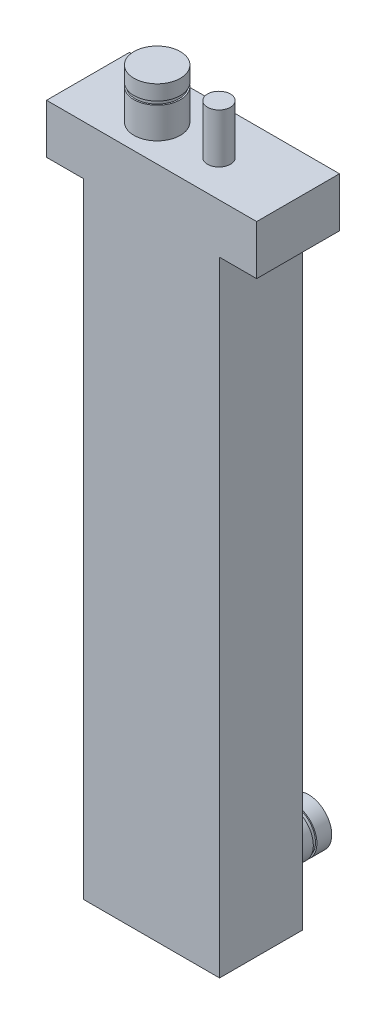
ISO-10303-21;
HEADER;
FILE_DESCRIPTION(('STEP AP214'),'2;1');
FILE_NAME('part.step','',(''),(''),'','','');
FILE_SCHEMA(('AUTOMOTIVE_DESIGN { 1 0 10303 214 1 1 1 1 }'));
ENDSEC;
DATA;
#1=APPLICATION_CONTEXT('core data for automotive mechanical design processes');
#2=APPLICATION_PROTOCOL_DEFINITION('international standard','automotive_design',2000,#1);
#3=PRODUCT_CONTEXT('',#1,'mechanical');
#4=PRODUCT('Part','Part','',(#3));
#5=PRODUCT_RELATED_PRODUCT_CATEGORY('part','',(#4));
#6=PRODUCT_DEFINITION_FORMATION('','',#4);
#7=PRODUCT_DEFINITION_CONTEXT('part definition',#1,'design');
#8=PRODUCT_DEFINITION('design','',#6,#7);
#9=PRODUCT_DEFINITION_SHAPE('','',#8);
#10=(LENGTH_UNIT() NAMED_UNIT(*) SI_UNIT(.MILLI.,.METRE.));
#11=(NAMED_UNIT(*) PLANE_ANGLE_UNIT() SI_UNIT($,.RADIAN.));
#12=(NAMED_UNIT(*) SI_UNIT($,.STERADIAN.) SOLID_ANGLE_UNIT());
#13=UNCERTAINTY_MEASURE_WITH_UNIT(LENGTH_MEASURE(1.E-05),#10,'distance_accuracy_value','');
#14=(GEOMETRIC_REPRESENTATION_CONTEXT(3) GLOBAL_UNCERTAINTY_ASSIGNED_CONTEXT((#13)) GLOBAL_UNIT_ASSIGNED_CONTEXT((#10,
#11,#12)) REPRESENTATION_CONTEXT('',''));
#15=CARTESIAN_POINT('',(0.,0.,0.));
#16=DIRECTION('',(0.,0.,1.));
#17=DIRECTION('',(1.,0.,0.));
#18=AXIS2_PLACEMENT_3D('',#15,#16,#17);
#19=CARTESIAN_POINT('',(-11.43,20.32,0.));
#20=DIRECTION('',(0.,-1.,0.));
#21=DIRECTION('',(0.,0.,-1.));
#22=AXIS2_PLACEMENT_3D('',#19,#20,#21);
#23=CYLINDRICAL_SURFACE('',#22,4.7625);
#24=CARTESIAN_POINT('',(-11.43,10.16,0.));
#25=DIRECTION('',(0.,1.,0.));
#26=DIRECTION('',(0.,0.,1.));
#27=AXIS2_PLACEMENT_3D('',#24,#25,#26);
#28=CIRCLE('',#27,4.7625);
#29=CARTESIAN_POINT('',(-11.43,10.16,4.7625));
#30=VERTEX_POINT('',#29);
#31=EDGE_CURVE('E168',#30,#30,#28,.T.);
#32=ORIENTED_EDGE('',*,*,#31,.T.);
#33=EDGE_LOOP('',(#32));
#34=FACE_BOUND('',#33,.T.);
#35=CARTESIAN_POINT('',(-11.43,16.51,0.));
#36=DIRECTION('',(0.,1.,0.));
#37=DIRECTION('',(0.,0.,1.));
#38=AXIS2_PLACEMENT_3D('',#35,#36,#37);
#39=CIRCLE('',#38,4.7625);
#40=CARTESIAN_POINT('',(-11.43,16.51,4.7625));
#41=VERTEX_POINT('',#40);
#42=EDGE_CURVE('E49',#41,#41,#39,.T.);
#43=ORIENTED_EDGE('',*,*,#42,.F.);
#44=EDGE_LOOP('',(#43));
#45=FACE_BOUND('',#44,.T.);
#46=ADVANCED_FACE('F40',(#34,#45),#23,.T.);
#47=CARTESIAN_POINT('',(0.,0.,0.));
#48=DIRECTION('',(0.,1.,0.));
#49=DIRECTION('',(0.,0.,1.));
#50=AXIS2_PLACEMENT_3D('',#47,#48,#49);
#51=PLANE('',#50);
#52=DIRECTION('',(1.,0.,0.));
#53=VECTOR('',#52,1.);
#54=CARTESIAN_POINT('',(0.,0.,7.493));
#55=LINE('',#54,#53);
#56=CARTESIAN_POINT('',(-26.67,0.,7.493));
#57=VERTEX_POINT('',#56);
#58=CARTESIAN_POINT('',(-19.05,0.,7.493));
#59=VERTEX_POINT('',#58);
#60=EDGE_CURVE('E106',#57,#59,#55,.T.);
#61=ORIENTED_EDGE('',*,*,#60,.F.);
#62=DIRECTION('',(0.,0.,1.));
#63=VECTOR('',#62,1.);
#64=CARTESIAN_POINT('',(-26.67,0.,-9.525));
#65=LINE('',#64,#63);
#66=CARTESIAN_POINT('',(-26.67,0.,-9.525));
#67=VERTEX_POINT('',#66);
#68=EDGE_CURVE('E151',#67,#57,#65,.T.);
#69=ORIENTED_EDGE('',*,*,#68,.F.);
#70=DIRECTION('',(-1.,0.,0.));
#71=VECTOR('',#70,1.);
#72=CARTESIAN_POINT('',(11.43,0.,-9.525));
#73=LINE('',#72,#71);
#74=CARTESIAN_POINT('',(-19.05,0.,-9.525));
#75=VERTEX_POINT('',#74);
#76=EDGE_CURVE('E143',#75,#67,#73,.T.);
#77=ORIENTED_EDGE('',*,*,#76,.F.);
#78=DIRECTION('',(0.,0.,-1.));
#79=VECTOR('',#78,1.);
#80=CARTESIAN_POINT('',(-19.05,0.,9.525));
#81=LINE('',#80,#79);
#82=EDGE_CURVE('E134',#59,#75,#81,.T.);
#83=ORIENTED_EDGE('',*,*,#82,.F.);
#84=EDGE_LOOP('',(#61,#69,#77,#83));
#85=FACE_BOUND('',#84,.T.);
#86=ADVANCED_FACE('F248',(#85),#51,.F.);
#87=DIRECTION('',(1.,0.,0.));
#88=VECTOR('',#87,1.);
#89=CARTESIAN_POINT('',(0.,0.,7.493));
#90=LINE('',#89,#88);
#91=CARTESIAN_POINT('',(8.89000000000001,0.,7.493));
#92=VERTEX_POINT('',#91);
#93=CARTESIAN_POINT('',(16.51,0.,7.493));
#94=VERTEX_POINT('',#93);
#95=EDGE_CURVE('E191',#92,#94,#90,.T.);
#96=ORIENTED_EDGE('',*,*,#95,.F.);
#97=DIRECTION('',(0.,0.,1.));
#98=VECTOR('',#97,1.);
#99=CARTESIAN_POINT('',(8.89000000000001,0.,9.525));
#100=LINE('',#99,#98);
#101=CARTESIAN_POINT('',(8.89000000000001,0.,-9.525));
#102=VERTEX_POINT('',#101);
#103=EDGE_CURVE('E133',#102,#92,#100,.T.);
#104=ORIENTED_EDGE('',*,*,#103,.F.);
#105=CARTESIAN_POINT('',(16.51,0.,-9.525));
#106=VERTEX_POINT('',#105);
#107=EDGE_CURVE('E167',#106,#102,#73,.T.);
#108=ORIENTED_EDGE('',*,*,#107,.F.);
#109=DIRECTION('',(0.,0.,-1.));
#110=VECTOR('',#109,1.);
#111=CARTESIAN_POINT('',(16.51,0.,9.52499999999999));
#112=LINE('',#111,#110);
#113=EDGE_CURVE('E144',#94,#106,#112,.T.);
#114=ORIENTED_EDGE('',*,*,#113,.F.);
#115=EDGE_LOOP('',(#96,#104,#108,#114));
#116=FACE_BOUND('',#115,.T.);
#117=ADVANCED_FACE('F253',(#116),#51,.F.);
#118=CARTESIAN_POINT('',(0.,10.16,0.));
#119=DIRECTION('',(0.,1.,0.));
#120=DIRECTION('',(0.,0.,1.));
#121=AXIS2_PLACEMENT_3D('',#118,#119,#120);
#122=PLANE('',#121);
#123=CARTESIAN_POINT('',(1.27000000000001,10.16,0.));
#124=DIRECTION('',(0.,1.,0.));
#125=DIRECTION('',(0.,0.,1.));
#126=AXIS2_PLACEMENT_3D('',#123,#124,#125);
#127=CIRCLE('',#126,2.35729593622905);
#128=CARTESIAN_POINT('',(1.27000000000001,10.16,2.35729593622905));
#129=VERTEX_POINT('',#128);
#130=EDGE_CURVE('E164',#129,#129,#127,.T.);
#131=ORIENTED_EDGE('',*,*,#130,.F.);
#132=EDGE_LOOP('',(#131));
#133=FACE_BOUND('',#132,.T.);
#134=ORIENTED_EDGE('',*,*,#31,.F.);
#135=EDGE_LOOP('',(#134));
#136=FACE_BOUND('',#135,.T.);
#137=DIRECTION('',(0.,0.,-1.));
#138=VECTOR('',#137,1.);
#139=CARTESIAN_POINT('',(-26.67,10.16,-9.525));
#140=LINE('',#139,#138);
#141=CARTESIAN_POINT('',(-26.67,10.16,7.493));
#142=VERTEX_POINT('',#141);
#143=CARTESIAN_POINT('',(-26.67,10.16,-9.525));
#144=VERTEX_POINT('',#143);
#145=EDGE_CURVE('E155',#142,#144,#140,.T.);
#146=ORIENTED_EDGE('',*,*,#145,.F.);
#147=DIRECTION('',(-1.,0.,0.));
#148=VECTOR('',#147,1.);
#149=CARTESIAN_POINT('',(-26.67,10.16,7.493));
#150=LINE('',#149,#148);
#151=CARTESIAN_POINT('',(16.51,10.16,7.493));
#152=VERTEX_POINT('',#151);
#153=EDGE_CURVE('E195',#152,#142,#150,.T.);
#154=ORIENTED_EDGE('',*,*,#153,.F.);
#155=DIRECTION('',(0.,0.,1.));
#156=VECTOR('',#155,1.);
#157=CARTESIAN_POINT('',(16.51,10.16,9.52499999999999));
#158=LINE('',#157,#156);
#159=CARTESIAN_POINT('',(16.51,10.16,-9.525));
#160=VERTEX_POINT('',#159);
#161=EDGE_CURVE('E146',#160,#152,#158,.T.);
#162=ORIENTED_EDGE('',*,*,#161,.F.);
#163=DIRECTION('',(-1.,0.,0.));
#164=VECTOR('',#163,1.);
#165=CARTESIAN_POINT('',(11.43,10.16,-9.525));
#166=LINE('',#165,#164);
#167=EDGE_CURVE('E159',#160,#144,#166,.T.);
#168=ORIENTED_EDGE('',*,*,#167,.T.);
#169=EDGE_LOOP('',(#146,#154,#162,#168));
#170=FACE_BOUND('',#169,.T.);
#171=ADVANCED_FACE('F205',(#133,#136,#170),#122,.T.);
#172=CARTESIAN_POINT('',(-26.67,0.,0.));
#173=DIRECTION('',(1.,0.,0.));
#174=DIRECTION('',(0.,0.,-1.));
#175=AXIS2_PLACEMENT_3D('',#172,#173,#174);
#176=PLANE('',#175);
#177=DIRECTION('',(0.,-1.,0.));
#178=VECTOR('',#177,1.);
#179=CARTESIAN_POINT('',(-26.67,10.16,7.493));
#180=LINE('',#179,#178);
#181=EDGE_CURVE('E43',#142,#57,#180,.T.);
#182=ORIENTED_EDGE('',*,*,#181,.F.);
#183=ORIENTED_EDGE('',*,*,#145,.T.);
#184=DIRECTION('',(0.,-1.,0.));
#185=VECTOR('',#184,1.);
#186=CARTESIAN_POINT('',(-26.67,0.,-9.525));
#187=LINE('',#186,#185);
#188=EDGE_CURVE('E152',#144,#67,#187,.T.);
#189=ORIENTED_EDGE('',*,*,#188,.T.);
#190=ORIENTED_EDGE('',*,*,#68,.T.);
#191=EDGE_LOOP('',(#182,#183,#189,#190));
#192=FACE_BOUND('',#191,.T.);
#193=ADVANCED_FACE('F217',(#192),#176,.F.);
#194=CARTESIAN_POINT('',(16.51,0.,0.));
#195=DIRECTION('',(1.,0.,0.));
#196=DIRECTION('',(0.,0.,-1.));
#197=AXIS2_PLACEMENT_3D('',#194,#195,#196);
#198=PLANE('',#197);
#199=ORIENTED_EDGE('',*,*,#161,.T.);
#200=DIRECTION('',(0.,1.,0.));
#201=VECTOR('',#200,1.);
#202=CARTESIAN_POINT('',(16.51,10.16,7.493));
#203=LINE('',#202,#201);
#204=EDGE_CURVE('E193',#94,#152,#203,.T.);
#205=ORIENTED_EDGE('',*,*,#204,.F.);
#206=ORIENTED_EDGE('',*,*,#113,.T.);
#207=DIRECTION('',(0.,1.,0.));
#208=VECTOR('',#207,1.);
#209=CARTESIAN_POINT('',(16.51,10.16,-9.525));
#210=LINE('',#209,#208);
#211=EDGE_CURVE('E137',#106,#160,#210,.T.);
#212=ORIENTED_EDGE('',*,*,#211,.T.);
#213=EDGE_LOOP('',(#199,#205,#206,#212));
#214=FACE_BOUND('',#213,.T.);
#215=ADVANCED_FACE('F206',(#214),#198,.T.);
#216=CARTESIAN_POINT('',(-19.05,-128.27,9.525));
#217=DIRECTION('',(1.,0.,0.));
#218=DIRECTION('',(0.,0.,-1.));
#219=AXIS2_PLACEMENT_3D('',#216,#217,#218);
#220=PLANE('',#219);
#221=DIRECTION('',(0.,-1.,0.));
#222=VECTOR('',#221,1.);
#223=CARTESIAN_POINT('',(-19.05,-128.27,7.493));
#224=LINE('',#223,#222);
#225=CARTESIAN_POINT('',(-19.05,-128.27,7.493));
#226=VERTEX_POINT('',#225);
#227=EDGE_CURVE('E101',#59,#226,#224,.T.);
#228=ORIENTED_EDGE('',*,*,#227,.F.);
#229=ORIENTED_EDGE('',*,*,#82,.T.);
#230=DIRECTION('',(0.,1.,0.));
#231=VECTOR('',#230,1.);
#232=CARTESIAN_POINT('',(-19.05,-128.27,-9.525));
#233=LINE('',#232,#231);
#234=CARTESIAN_POINT('',(-19.05,-128.27,-9.525));
#235=VERTEX_POINT('',#234);
#236=EDGE_CURVE('E124',#235,#75,#233,.T.);
#237=ORIENTED_EDGE('',*,*,#236,.F.);
#238=DIRECTION('',(0.,0.,-1.));
#239=VECTOR('',#238,1.);
#240=CARTESIAN_POINT('',(-19.05,-128.27,9.525));
#241=LINE('',#240,#239);
#242=EDGE_CURVE('E116',#226,#235,#241,.T.);
#243=ORIENTED_EDGE('',*,*,#242,.F.);
#244=EDGE_LOOP('',(#228,#229,#237,#243));
#245=FACE_BOUND('',#244,.T.);
#246=ADVANCED_FACE('F122',(#245),#220,.F.);
#247=CARTESIAN_POINT('',(8.89000000000001,-128.27,9.525));
#248=DIRECTION('',(-1.,0.,0.));
#249=DIRECTION('',(0.,0.,1.));
#250=AXIS2_PLACEMENT_3D('',#247,#248,#249);
#251=PLANE('',#250);
#252=DIRECTION('',(0.,1.,0.));
#253=VECTOR('',#252,1.);
#254=CARTESIAN_POINT('',(8.89000000000001,-128.27,7.493));
#255=LINE('',#254,#253);
#256=CARTESIAN_POINT('',(8.89000000000001,-128.27,7.493));
#257=VERTEX_POINT('',#256);
#258=EDGE_CURVE('E110',#257,#92,#255,.T.);
#259=ORIENTED_EDGE('',*,*,#258,.F.);
#260=DIRECTION('',(0.,0.,1.));
#261=VECTOR('',#260,1.);
#262=CARTESIAN_POINT('',(8.89000000000001,-128.27,9.525));
#263=LINE('',#262,#261);
#264=CARTESIAN_POINT('',(8.89000000000001,-128.27,-9.525));
#265=VERTEX_POINT('',#264);
#266=EDGE_CURVE('E119',#265,#257,#263,.T.);
#267=ORIENTED_EDGE('',*,*,#266,.F.);
#268=DIRECTION('',(0.,1.,0.));
#269=VECTOR('',#268,1.);
#270=CARTESIAN_POINT('',(8.89000000000001,-128.27,-9.525));
#271=LINE('',#270,#269);
#272=EDGE_CURVE('E136',#265,#102,#271,.T.);
#273=ORIENTED_EDGE('',*,*,#272,.T.);
#274=ORIENTED_EDGE('',*,*,#103,.T.);
#275=EDGE_LOOP('',(#259,#267,#273,#274));
#276=FACE_BOUND('',#275,.T.);
#277=ADVANCED_FACE('F319',(#276),#251,.F.);
#278=CARTESIAN_POINT('',(0.,-128.27,0.));
#279=DIRECTION('',(0.,-1.,0.));
#280=DIRECTION('',(0.,0.,-1.));
#281=AXIS2_PLACEMENT_3D('',#278,#279,#280);
#282=PLANE('',#281);
#283=ORIENTED_EDGE('',*,*,#266,.T.);
#284=DIRECTION('',(-1.,0.,0.));
#285=VECTOR('',#284,1.);
#286=CARTESIAN_POINT('',(0.,-128.27,7.493));
#287=LINE('',#286,#285);
#288=EDGE_CURVE('E104',#257,#226,#287,.T.);
#289=ORIENTED_EDGE('',*,*,#288,.T.);
#290=ORIENTED_EDGE('',*,*,#242,.T.);
#291=DIRECTION('',(1.,0.,0.));
#292=VECTOR('',#291,1.);
#293=CARTESIAN_POINT('',(-19.05,-128.27,-9.525));
#294=LINE('',#293,#292);
#295=CARTESIAN_POINT('',(-5.07999999999999,-128.27,-9.525));
#296=VERTEX_POINT('',#295);
#297=EDGE_CURVE('E125',#235,#296,#294,.T.);
#298=ORIENTED_EDGE('',*,*,#297,.T.);
#299=EDGE_CURVE('E127',#296,#265,#294,.T.);
#300=ORIENTED_EDGE('',*,*,#299,.T.);
#301=EDGE_LOOP('',(#283,#289,#290,#298,#300));
#302=FACE_BOUND('',#301,.T.);
#303=ADVANCED_FACE('F114',(#302),#282,.T.);
#304=CARTESIAN_POINT('',(11.43,10.16,-9.525));
#305=DIRECTION('',(0.,0.,1.));
#306=DIRECTION('',(1.,0.,0.));
#307=AXIS2_PLACEMENT_3D('',#304,#305,#306);
#308=PLANE('',#307);
#309=ORIENTED_EDGE('',*,*,#299,.F.);
#310=CARTESIAN_POINT('',(-5.07999999999999,-123.5075,-9.525));
#311=DIRECTION('',(0.,0.,1.));
#312=DIRECTION('',(1.,0.,0.));
#313=AXIS2_PLACEMENT_3D('',#310,#311,#312);
#314=CIRCLE('',#313,4.76249999999999);
#315=EDGE_CURVE('E130',#296,#296,#314,.T.);
#316=ORIENTED_EDGE('',*,*,#315,.T.);
#317=ORIENTED_EDGE('',*,*,#297,.F.);
#318=ORIENTED_EDGE('',*,*,#236,.T.);
#319=ORIENTED_EDGE('',*,*,#76,.T.);
#320=ORIENTED_EDGE('',*,*,#188,.F.);
#321=ORIENTED_EDGE('',*,*,#167,.F.);
#322=ORIENTED_EDGE('',*,*,#211,.F.);
#323=ORIENTED_EDGE('',*,*,#107,.T.);
#324=ORIENTED_EDGE('',*,*,#272,.F.);
#325=EDGE_LOOP('',(#309,#316,#317,#318,#319,#320,#321,#322,#323,#324));
#326=FACE_BOUND('',#325,.T.);
#327=ADVANCED_FACE('F211',(#326),#308,.F.);
#328=CARTESIAN_POINT('',(1.27000000000001,20.32,0.));
#329=DIRECTION('',(0.,-1.,0.));
#330=DIRECTION('',(0.,0.,-1.));
#331=AXIS2_PLACEMENT_3D('',#328,#329,#330);
#332=CYLINDRICAL_SURFACE('',#331,2.35729593622905);
#333=CARTESIAN_POINT('',(1.27000000000001,20.32,0.));
#334=DIRECTION('',(0.,1.,0.));
#335=DIRECTION('',(0.,0.,1.));
#336=AXIS2_PLACEMENT_3D('',#333,#334,#335);
#337=CIRCLE('',#336,2.35729593622905);
#338=CARTESIAN_POINT('',(1.27000000000001,20.32,2.35729593622905));
#339=VERTEX_POINT('',#338);
#340=EDGE_CURVE('E160',#339,#339,#337,.T.);
#341=ORIENTED_EDGE('',*,*,#340,.F.);
#342=EDGE_LOOP('',(#341));
#343=FACE_BOUND('',#342,.T.);
#344=ORIENTED_EDGE('',*,*,#130,.T.);
#345=EDGE_LOOP('',(#344));
#346=FACE_BOUND('',#345,.T.);
#347=ADVANCED_FACE('F270',(#343,#346),#332,.T.);
#348=CARTESIAN_POINT('',(1.27000000000001,20.32,0.));
#349=DIRECTION('',(0.,1.,0.));
#350=DIRECTION('',(0.,0.,1.));
#351=AXIS2_PLACEMENT_3D('',#348,#349,#350);
#352=PLANE('',#351);
#353=ORIENTED_EDGE('',*,*,#340,.T.);
#354=EDGE_LOOP('',(#353));
#355=FACE_BOUND('',#354,.T.);
#356=ADVANCED_FACE('F312',(#355),#352,.T.);
#357=CARTESIAN_POINT('',(-5.07999999999999,-123.5075,-24.765));
#358=DIRECTION('',(0.,0.,1.));
#359=DIRECTION('',(1.,0.,0.));
#360=AXIS2_PLACEMENT_3D('',#357,#358,#359);
#361=CYLINDRICAL_SURFACE('',#360,4.76249999999999);
#362=CARTESIAN_POINT('',(-5.07999999999999,-123.5075,-20.9804));
#363=DIRECTION('',(0.,0.,1.));
#364=DIRECTION('',(1.,0.,0.));
#365=AXIS2_PLACEMENT_3D('',#362,#363,#364);
#366=CIRCLE('',#365,4.76249999999999);
#367=CARTESIAN_POINT('',(-0.317499999999991,-123.5075,-20.9804));
#368=VERTEX_POINT('',#367);
#369=EDGE_CURVE('E163',#368,#368,#366,.F.);
#370=ORIENTED_EDGE('',*,*,#369,.F.);
#371=EDGE_LOOP('',(#370));
#372=FACE_BOUND('',#371,.T.);
#373=ORIENTED_EDGE('',*,*,#315,.F.);
#374=EDGE_LOOP('',(#373));
#375=FACE_BOUND('',#374,.T.);
#376=ADVANCED_FACE('F309',(#372,#375),#361,.T.);
#377=CARTESIAN_POINT('',(0.,0.,-20.9804));
#378=DIRECTION('',(0.,0.,1.));
#379=DIRECTION('',(1.,0.,0.));
#380=AXIS2_PLACEMENT_3D('',#377,#378,#379);
#381=PLANE('',#380);
#382=CARTESIAN_POINT('',(-5.07999999999999,-123.5075,-20.9804));
#383=DIRECTION('',(0.,0.,-1.));
#384=DIRECTION('',(-1.,0.,0.));
#385=AXIS2_PLACEMENT_3D('',#382,#383,#384);
#386=CIRCLE('',#385,4.4704);
#387=CARTESIAN_POINT('',(-9.55039999999999,-123.5075,-20.9804));
#388=VERTEX_POINT('',#387);
#389=EDGE_CURVE('E181',#388,#388,#386,.T.);
#390=ORIENTED_EDGE('',*,*,#389,.F.);
#391=EDGE_LOOP('',(#390));
#392=FACE_BOUND('',#391,.T.);
#393=ORIENTED_EDGE('',*,*,#369,.T.);
#394=EDGE_LOOP('',(#393));
#395=FACE_BOUND('',#394,.T.);
#396=ADVANCED_FACE('F279',(#392,#395),#381,.F.);
#397=CARTESIAN_POINT('',(-5.07999999999999,-123.5075,-34.3612006184653));
#398=DIRECTION('',(0.,0.,1.));
#399=DIRECTION('',(1.,0.,0.));
#400=AXIS2_PLACEMENT_3D('',#397,#398,#399);
#401=CYLINDRICAL_SURFACE('',#400,4.4704);
#402=CARTESIAN_POINT('',(-5.07999999999999,-123.5075,-21.717));
#403=DIRECTION('',(0.,0.,1.));
#404=DIRECTION('',(1.,0.,0.));
#405=AXIS2_PLACEMENT_3D('',#402,#403,#404);
#406=CIRCLE('',#405,4.4704);
#407=CARTESIAN_POINT('',(-0.609599999999987,-123.5075,-21.717));
#408=VERTEX_POINT('',#407);
#409=EDGE_CURVE('E178',#408,#408,#406,.T.);
#410=ORIENTED_EDGE('',*,*,#409,.T.);
#411=EDGE_LOOP('',(#410));
#412=FACE_BOUND('',#411,.T.);
#413=ORIENTED_EDGE('',*,*,#389,.T.);
#414=EDGE_LOOP('',(#413));
#415=FACE_BOUND('',#414,.T.);
#416=ADVANCED_FACE('F275',(#412,#415),#401,.T.);
#417=CARTESIAN_POINT('',(-5.07999999999999,-123.5075,-24.765));
#418=DIRECTION('',(0.,0.,-1.));
#419=DIRECTION('',(1.,0.,0.));
#420=AXIS2_PLACEMENT_3D('',#417,#418,#419);
#421=PLANE('',#420);
#422=CARTESIAN_POINT('',(-5.07999999999999,-123.5075,-24.765));
#423=DIRECTION('',(0.,0.,1.));
#424=DIRECTION('',(1.,0.,0.));
#425=AXIS2_PLACEMENT_3D('',#422,#423,#424);
#426=CIRCLE('',#425,4.76249999999999);
#427=CARTESIAN_POINT('',(-0.317499999999991,-123.5075,-24.765));
#428=VERTEX_POINT('',#427);
#429=EDGE_CURVE('E184',#428,#428,#426,.T.);
#430=ORIENTED_EDGE('',*,*,#429,.F.);
#431=EDGE_LOOP('',(#430));
#432=FACE_BOUND('',#431,.T.);
#433=ADVANCED_FACE('F278',(#432),#421,.T.);
#434=CARTESIAN_POINT('',(-5.07999999999999,-123.5075,-24.765));
#435=DIRECTION('',(0.,0.,1.));
#436=DIRECTION('',(1.,0.,0.));
#437=AXIS2_PLACEMENT_3D('',#434,#435,#436);
#438=CYLINDRICAL_SURFACE('',#437,4.76249999999999);
#439=CARTESIAN_POINT('',(-5.07999999999999,-123.5075,-21.717));
#440=DIRECTION('',(0.,0.,1.));
#441=DIRECTION('',(1.,0.,0.));
#442=AXIS2_PLACEMENT_3D('',#439,#440,#441);
#443=CIRCLE('',#442,4.76249999999999);
#444=CARTESIAN_POINT('',(-0.317499999999991,-123.5075,-21.717));
#445=VERTEX_POINT('',#444);
#446=EDGE_CURVE('E185',#445,#445,#443,.F.);
#447=CARTESIAN_POINT('',(-0.317499999999991,-123.5075,-24.765));
#448=CARTESIAN_POINT('',(-0.317499999999991,-123.5075,-24.73325));
#449=CARTESIAN_POINT('',(-0.317499999999991,-123.5075,-24.7015));
#450=CARTESIAN_POINT('',(-0.317499999999991,-123.5075,-24.638));
#451=CARTESIAN_POINT('',(-0.317499999999991,-123.5075,-24.60625));
#452=CARTESIAN_POINT('',(-0.317499999999991,-123.5075,-24.54275));
#453=CARTESIAN_POINT('',(-0.317499999999991,-123.5075,-24.511));
#454=CARTESIAN_POINT('',(-0.317499999999991,-123.5075,-24.4475));
#455=CARTESIAN_POINT('',(-0.317499999999991,-123.5075,-24.41575));
#456=CARTESIAN_POINT('',(-0.317499999999991,-123.5075,-24.35225));
#457=CARTESIAN_POINT('',(-0.317499999999991,-123.5075,-24.3205));
#458=CARTESIAN_POINT('',(-0.317499999999991,-123.5075,-24.257));
#459=CARTESIAN_POINT('',(-0.317499999999991,-123.5075,-24.22525));
#460=CARTESIAN_POINT('',(-0.317499999999991,-123.5075,-24.16175));
#461=CARTESIAN_POINT('',(-0.317499999999991,-123.5075,-24.13));
#462=CARTESIAN_POINT('',(-0.317499999999991,-123.5075,-24.0665));
#463=CARTESIAN_POINT('',(-0.317499999999991,-123.5075,-24.03475));
#464=CARTESIAN_POINT('',(-0.317499999999991,-123.5075,-23.97125));
#465=CARTESIAN_POINT('',(-0.317499999999991,-123.5075,-23.9395));
#466=CARTESIAN_POINT('',(-0.317499999999991,-123.5075,-23.876));
#467=CARTESIAN_POINT('',(-0.317499999999991,-123.5075,-23.84425));
#468=CARTESIAN_POINT('',(-0.317499999999991,-123.5075,-23.78075));
#469=CARTESIAN_POINT('',(-0.317499999999991,-123.5075,-23.749));
#470=CARTESIAN_POINT('',(-0.317499999999991,-123.5075,-23.6855));
#471=CARTESIAN_POINT('',(-0.317499999999991,-123.5075,-23.65375));
#472=CARTESIAN_POINT('',(-0.317499999999991,-123.5075,-23.59025));
#473=CARTESIAN_POINT('',(-0.317499999999991,-123.5075,-23.5585));
#474=CARTESIAN_POINT('',(-0.317499999999991,-123.5075,-23.495));
#475=CARTESIAN_POINT('',(-0.317499999999991,-123.5075,-23.46325));
#476=CARTESIAN_POINT('',(-0.317499999999991,-123.5075,-23.39975));
#477=CARTESIAN_POINT('',(-0.317499999999991,-123.5075,-23.368));
#478=CARTESIAN_POINT('',(-0.317499999999991,-123.5075,-23.3045));
#479=CARTESIAN_POINT('',(-0.317499999999991,-123.5075,-23.27275));
#480=CARTESIAN_POINT('',(-0.317499999999991,-123.5075,-23.20925));
#481=CARTESIAN_POINT('',(-0.317499999999991,-123.5075,-23.1775));
#482=CARTESIAN_POINT('',(-0.317499999999991,-123.5075,-23.114));
#483=CARTESIAN_POINT('',(-0.317499999999991,-123.5075,-23.08225));
#484=CARTESIAN_POINT('',(-0.317499999999991,-123.5075,-23.01875));
#485=CARTESIAN_POINT('',(-0.317499999999991,-123.5075,-22.987));
#486=CARTESIAN_POINT('',(-0.317499999999991,-123.5075,-22.9235));
#487=CARTESIAN_POINT('',(-0.317499999999991,-123.5075,-22.89175));
#488=CARTESIAN_POINT('',(-0.317499999999991,-123.5075,-22.82825));
#489=CARTESIAN_POINT('',(-0.317499999999991,-123.5075,-22.7965));
#490=CARTESIAN_POINT('',(-0.317499999999991,-123.5075,-22.733));
#491=CARTESIAN_POINT('',(-0.317499999999991,-123.5075,-22.70125));
#492=CARTESIAN_POINT('',(-0.317499999999991,-123.5075,-22.63775));
#493=CARTESIAN_POINT('',(-0.317499999999991,-123.5075,-22.606));
#494=CARTESIAN_POINT('',(-0.317499999999991,-123.5075,-22.5425));
#495=CARTESIAN_POINT('',(-0.317499999999991,-123.5075,-22.51075));
#496=CARTESIAN_POINT('',(-0.317499999999991,-123.5075,-22.44725));
#497=CARTESIAN_POINT('',(-0.317499999999991,-123.5075,-22.4155));
#498=CARTESIAN_POINT('',(-0.317499999999991,-123.5075,-22.352));
#499=CARTESIAN_POINT('',(-0.317499999999991,-123.5075,-22.32025));
#500=CARTESIAN_POINT('',(-0.317499999999991,-123.5075,-22.25675));
#501=CARTESIAN_POINT('',(-0.317499999999991,-123.5075,-22.225));
#502=CARTESIAN_POINT('',(-0.317499999999991,-123.5075,-22.1615));
#503=CARTESIAN_POINT('',(-0.317499999999991,-123.5075,-22.12975));
#504=CARTESIAN_POINT('',(-0.317499999999991,-123.5075,-22.06625));
#505=CARTESIAN_POINT('',(-0.317499999999991,-123.5075,-22.0345));
#506=CARTESIAN_POINT('',(-0.317499999999991,-123.5075,-21.971));
#507=CARTESIAN_POINT('',(-0.317499999999991,-123.5075,-21.93925));
#508=CARTESIAN_POINT('',(-0.317499999999991,-123.5075,-21.87575));
#509=CARTESIAN_POINT('',(-0.317499999999991,-123.5075,-21.844));
#510=CARTESIAN_POINT('',(-0.317499999999991,-123.5075,-21.7805));
#511=CARTESIAN_POINT('',(-0.317499999999991,-123.5075,-21.74875));
#512=CARTESIAN_POINT('',(-0.317499999999991,-123.5075,-21.717));
#513=B_SPLINE_CURVE_WITH_KNOTS('',3,(#447,#448,#449,#450,#451,#452,#453,#454,#455,#456,#457,
#458,#459,#460,#461,#462,#463,#464,#465,#466,#467,#468,#469,#470,#471,#472,#473,#474,#475,#476,
#477,#478,#479,#480,#481,#482,#483,#484,#485,#486,#487,#488,#489,#490,#491,#492,#493,#494,#495,
#496,#497,#498,#499,#500,#501,#502,#503,#504,#505,#506,#507,#508,#509,#510,#511,#512),
.UNSPECIFIED.,.F.,.F.,(4,2,2,2,2,2,2,2,2,2,2,2,2,2,2,2,2,2,2,2,2,2,2,2,2,2,2,2,2,2,2,2,4),(0.,
0.0952499999999981,0.1905,0.285749999999998,0.380999999999999,0.476250000000001,
0.571499999999999,0.666750000000001,0.761999999999999,0.85725,0.952500000000002,1.04775,1.143,
1.23825,1.3335,1.42875,1.524,1.61925,1.7145,1.80975,1.905,2.00025,2.0955,2.19075000000001,2.286,
2.38125,2.47650000000001,2.57175,2.66700000000001,2.76225000000001,2.85750000000001,
2.95275000000001,3.04800000000001),.UNSPECIFIED.);
#514=EDGE_CURVE('BSEAM281',#428,#445,#513,.T.);
#515=ORIENTED_EDGE('',*,*,#429,.T.);
#516=ORIENTED_EDGE('',*,*,#446,.T.);
#517=ORIENTED_EDGE('',*,*,#514,.T.);
#518=ORIENTED_EDGE('',*,*,#514,.F.);
#519=EDGE_LOOP('',(#515,#517,#516,#518));
#520=FACE_BOUND('',#519,.T.);
#521=ADVANCED_FACE('F281',(#520),#438,.T.);
#522=CARTESIAN_POINT('',(0.,0.,-21.717));
#523=DIRECTION('',(0.,0.,1.));
#524=DIRECTION('',(1.,0.,0.));
#525=AXIS2_PLACEMENT_3D('',#522,#523,#524);
#526=PLANE('',#525);
#527=ORIENTED_EDGE('',*,*,#409,.F.);
#528=EDGE_LOOP('',(#527));
#529=FACE_BOUND('',#528,.T.);
#530=ORIENTED_EDGE('',*,*,#446,.F.);
#531=EDGE_LOOP('',(#530));
#532=FACE_BOUND('',#531,.T.);
#533=ADVANCED_FACE('F284',(#529,#532),#526,.T.);
#534=CARTESIAN_POINT('',(0.,0.,7.493));
#535=DIRECTION('',(0.,0.,1.));
#536=DIRECTION('',(1.,0.,0.));
#537=AXIS2_PLACEMENT_3D('',#534,#535,#536);
#538=PLANE('',#537);
#539=ORIENTED_EDGE('',*,*,#60,.T.);
#540=ORIENTED_EDGE('',*,*,#227,.T.);
#541=ORIENTED_EDGE('',*,*,#288,.F.);
#542=ORIENTED_EDGE('',*,*,#258,.T.);
#543=ORIENTED_EDGE('',*,*,#95,.T.);
#544=ORIENTED_EDGE('',*,*,#204,.T.);
#545=ORIENTED_EDGE('',*,*,#153,.T.);
#546=ORIENTED_EDGE('',*,*,#181,.T.);
#547=EDGE_LOOP('',(#539,#540,#541,#542,#543,#544,#545,#546));
#548=FACE_BOUND('',#547,.T.);
#549=ADVANCED_FACE('F103',(#548),#538,.T.);
#550=CARTESIAN_POINT('',(0.,16.51,0.));
#551=DIRECTION('',(0.,1.,0.));
#552=DIRECTION('',(0.,0.,1.));
#553=AXIS2_PLACEMENT_3D('',#550,#551,#552);
#554=PLANE('',#553);
#555=CARTESIAN_POINT('',(-11.43,16.51,0.));
#556=DIRECTION('',(0.,1.,0.));
#557=DIRECTION('',(0.,0.,1.));
#558=AXIS2_PLACEMENT_3D('',#555,#556,#557);
#559=CIRCLE('',#558,4.4704);
#560=CARTESIAN_POINT('',(-11.43,16.51,4.4704));
#561=VERTEX_POINT('',#560);
#562=EDGE_CURVE('E12',#561,#561,#559,.T.);
#563=ORIENTED_EDGE('',*,*,#562,.F.);
#564=EDGE_LOOP('',(#563));
#565=FACE_BOUND('',#564,.T.);
#566=ORIENTED_EDGE('',*,*,#42,.T.);
#567=EDGE_LOOP('',(#566));
#568=FACE_BOUND('',#567,.T.);
#569=ADVANCED_FACE('F293',(#565,#568),#554,.T.);
#570=CARTESIAN_POINT('',(-11.43,29.8908006184654,0.));
#571=DIRECTION('',(0.,-1.,0.));
#572=DIRECTION('',(0.,0.,-1.));
#573=AXIS2_PLACEMENT_3D('',#570,#571,#572);
#574=CYLINDRICAL_SURFACE('',#573,4.4704);
#575=ORIENTED_EDGE('',*,*,#562,.T.);
#576=EDGE_LOOP('',(#575));
#577=FACE_BOUND('',#576,.T.);
#578=CARTESIAN_POINT('',(-11.43,17.2466,0.));
#579=DIRECTION('',(0.,1.,0.));
#580=DIRECTION('',(0.,0.,1.));
#581=AXIS2_PLACEMENT_3D('',#578,#579,#580);
#582=CIRCLE('',#581,4.4704);
#583=CARTESIAN_POINT('',(-11.43,17.2466,4.4704));
#584=VERTEX_POINT('',#583);
#585=EDGE_CURVE('E171',#584,#584,#582,.T.);
#586=ORIENTED_EDGE('',*,*,#585,.F.);
#587=EDGE_LOOP('',(#586));
#588=FACE_BOUND('',#587,.T.);
#589=ADVANCED_FACE('F245',(#577,#588),#574,.T.);
#590=CARTESIAN_POINT('',(-11.43,20.32,0.));
#591=DIRECTION('',(0.,1.,0.));
#592=DIRECTION('',(0.,0.,1.));
#593=AXIS2_PLACEMENT_3D('',#590,#591,#592);
#594=PLANE('',#593);
#595=CARTESIAN_POINT('',(-11.43,20.32,0.));
#596=DIRECTION('',(0.,1.,0.));
#597=DIRECTION('',(0.,0.,1.));
#598=AXIS2_PLACEMENT_3D('',#595,#596,#597);
#599=CIRCLE('',#598,4.7625);
#600=CARTESIAN_POINT('',(-11.43,20.32,4.7625));
#601=VERTEX_POINT('',#600);
#602=EDGE_CURVE('E224',#601,#601,#599,.T.);
#603=ORIENTED_EDGE('',*,*,#602,.T.);
#604=EDGE_LOOP('',(#603));
#605=FACE_BOUND('',#604,.T.);
#606=ADVANCED_FACE('F232',(#605),#594,.T.);
#607=CARTESIAN_POINT('',(-11.43,20.32,0.));
#608=DIRECTION('',(0.,-1.,0.));
#609=DIRECTION('',(0.,0.,-1.));
#610=AXIS2_PLACEMENT_3D('',#607,#608,#609);
#611=CYLINDRICAL_SURFACE('',#610,4.7625);
#612=CARTESIAN_POINT('',(-11.43,17.2466,0.));
#613=DIRECTION('',(0.,1.,0.));
#614=DIRECTION('',(0.,0.,1.));
#615=AXIS2_PLACEMENT_3D('',#612,#613,#614);
#616=CIRCLE('',#615,4.7625);
#617=CARTESIAN_POINT('',(-11.43,17.2466,4.7625));
#618=VERTEX_POINT('',#617);
#619=EDGE_CURVE('E226',#618,#618,#616,.T.);
#620=ORIENTED_EDGE('',*,*,#619,.T.);
#621=EDGE_LOOP('',(#620));
#622=FACE_BOUND('',#621,.T.);
#623=ORIENTED_EDGE('',*,*,#602,.F.);
#624=EDGE_LOOP('',(#623));
#625=FACE_BOUND('',#624,.T.);
#626=ADVANCED_FACE('F234',(#622,#625),#611,.T.);
#627=CARTESIAN_POINT('',(0.,17.2466,0.));
#628=DIRECTION('',(0.,1.,0.));
#629=DIRECTION('',(0.,0.,1.));
#630=AXIS2_PLACEMENT_3D('',#627,#628,#629);
#631=PLANE('',#630);
#632=ORIENTED_EDGE('',*,*,#585,.T.);
#633=EDGE_LOOP('',(#632));
#634=FACE_BOUND('',#633,.T.);
#635=ORIENTED_EDGE('',*,*,#619,.F.);
#636=EDGE_LOOP('',(#635));
#637=FACE_BOUND('',#636,.T.);
#638=ADVANCED_FACE('F236',(#634,#637),#631,.F.);
#639=CLOSED_SHELL('',(#46,#86,#117,#171,#193,#215,#246,#277,#303,#327,#347,#356,#376,#396,#416,
#433,#521,#533,#549,#569,#589,#606,#626,#638));
#640=MANIFOLD_SOLID_BREP('B2',#639);
#641=ADVANCED_BREP_SHAPE_REPRESENTATION('',(#18,#640),#14);
#642=SHAPE_DEFINITION_REPRESENTATION(#9,#641);
ENDSEC;
END-ISO-10303-21;
